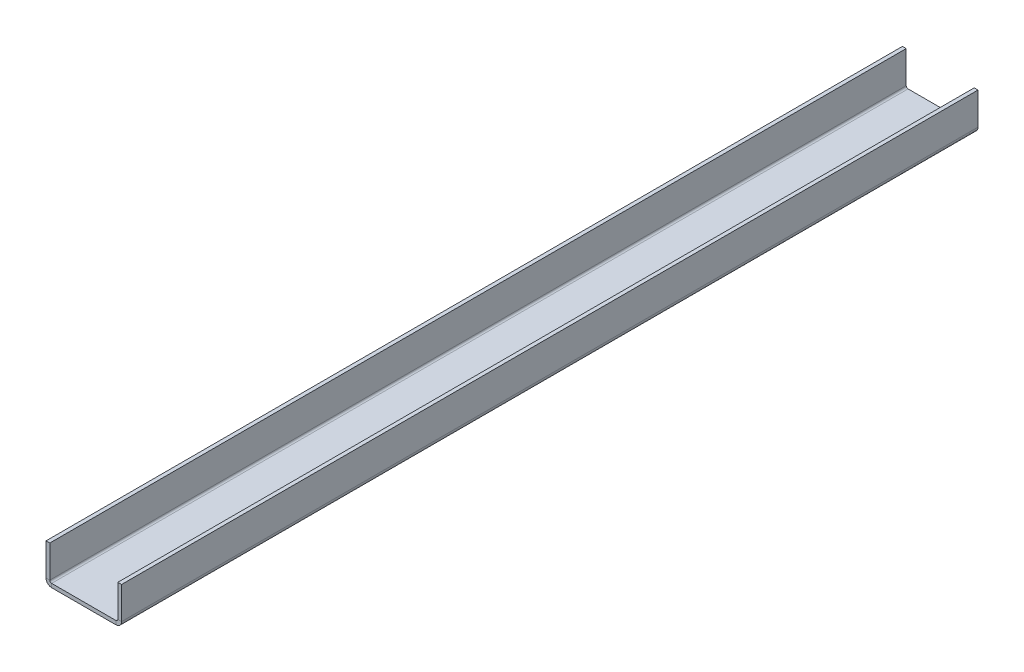
ISO-10303-21;
HEADER;
FILE_DESCRIPTION(('STEP AP214'),'2;1');
FILE_NAME('part.step','',(''),(''),'','','');
FILE_SCHEMA(('AUTOMOTIVE_DESIGN { 1 0 10303 214 1 1 1 1 }'));
ENDSEC;
DATA;
#1=APPLICATION_CONTEXT('core data for automotive mechanical design processes');
#2=APPLICATION_PROTOCOL_DEFINITION('international standard','automotive_design',2000,#1);
#3=PRODUCT_CONTEXT('',#1,'mechanical');
#4=PRODUCT('Part','Part','',(#3));
#5=PRODUCT_RELATED_PRODUCT_CATEGORY('part','',(#4));
#6=PRODUCT_DEFINITION_FORMATION('','',#4);
#7=PRODUCT_DEFINITION_CONTEXT('part definition',#1,'design');
#8=PRODUCT_DEFINITION('design','',#6,#7);
#9=PRODUCT_DEFINITION_SHAPE('','',#8);
#10=(LENGTH_UNIT() NAMED_UNIT(*) SI_UNIT(.MILLI.,.METRE.));
#11=(NAMED_UNIT(*) PLANE_ANGLE_UNIT() SI_UNIT($,.RADIAN.));
#12=(NAMED_UNIT(*) SI_UNIT($,.STERADIAN.) SOLID_ANGLE_UNIT());
#13=UNCERTAINTY_MEASURE_WITH_UNIT(LENGTH_MEASURE(1.E-05),#10,'distance_accuracy_value','');
#14=(GEOMETRIC_REPRESENTATION_CONTEXT(3) GLOBAL_UNCERTAINTY_ASSIGNED_CONTEXT((#13)) GLOBAL_UNIT_ASSIGNED_CONTEXT((#10,
#11,#12)) REPRESENTATION_CONTEXT('',''));
#15=CARTESIAN_POINT('',(0.,0.,0.));
#16=DIRECTION('',(0.,0.,1.));
#17=DIRECTION('',(1.,0.,0.));
#18=AXIS2_PLACEMENT_3D('',#15,#16,#17);
#19=CARTESIAN_POINT('',(0.,-1.5,0.));
#20=DIRECTION('',(0.,-1.,0.));
#21=DIRECTION('',(0.,0.,-1.));
#22=AXIS2_PLACEMENT_3D('',#19,#20,#21);
#23=PLANE('',#22);
#24=DIRECTION('',(1.,0.,0.));
#25=VECTOR('',#24,1.);
#26=CARTESIAN_POINT('',(-15.,-1.5,170.));
#27=LINE('',#26,#25);
#28=CARTESIAN_POINT('',(-12.7634,-1.5,170.));
#29=VERTEX_POINT('',#28);
#30=CARTESIAN_POINT('',(12.7634,-1.5,170.));
#31=VERTEX_POINT('',#30);
#32=EDGE_CURVE('E11',#29,#31,#27,.T.);
#33=ORIENTED_EDGE('',*,*,#32,.F.);
#34=DIRECTION('',(0.,0.,1.));
#35=VECTOR('',#34,1.);
#36=CARTESIAN_POINT('',(-12.7634,-1.5,170.));
#37=LINE('',#36,#35);
#38=CARTESIAN_POINT('',(-12.7634,-1.5,-170.));
#39=VERTEX_POINT('',#38);
#40=EDGE_CURVE('E149',#29,#39,#37,.F.);
#41=ORIENTED_EDGE('',*,*,#40,.T.);
#42=DIRECTION('',(-1.,0.,0.));
#43=VECTOR('',#42,1.);
#44=CARTESIAN_POINT('',(-15.,-1.5,-170.));
#45=LINE('',#44,#43);
#46=CARTESIAN_POINT('',(12.7634,-1.5,-170.));
#47=VERTEX_POINT('',#46);
#48=EDGE_CURVE('E26',#47,#39,#45,.T.);
#49=ORIENTED_EDGE('',*,*,#48,.F.);
#50=DIRECTION('',(0.,0.,-1.));
#51=VECTOR('',#50,1.);
#52=CARTESIAN_POINT('',(12.7634,-1.5,-170.));
#53=LINE('',#52,#51);
#54=EDGE_CURVE('E200',#47,#31,#53,.F.);
#55=ORIENTED_EDGE('',*,*,#54,.T.);
#56=EDGE_LOOP('',(#33,#41,#49,#55));
#57=FACE_BOUND('',#56,.T.);
#58=ADVANCED_FACE('F17',(#57),#23,.T.);
#59=CARTESIAN_POINT('',(0.,0.,0.));
#60=DIRECTION('',(0.,-1.,0.));
#61=DIRECTION('',(0.,0.,-1.));
#62=AXIS2_PLACEMENT_3D('',#59,#60,#61);
#63=PLANE('',#62);
#64=DIRECTION('',(0.,0.,1.));
#65=VECTOR('',#64,1.);
#66=CARTESIAN_POINT('',(-12.7634,0.,170.));
#67=LINE('',#66,#65);
#68=CARTESIAN_POINT('',(-12.7634,0.,170.));
#69=VERTEX_POINT('',#68);
#70=CARTESIAN_POINT('',(-12.7634,0.,-170.));
#71=VERTEX_POINT('',#70);
#72=EDGE_CURVE('E160',#69,#71,#67,.F.);
#73=ORIENTED_EDGE('',*,*,#72,.F.);
#74=DIRECTION('',(1.,0.,0.));
#75=VECTOR('',#74,1.);
#76=CARTESIAN_POINT('',(-15.,0.,170.));
#77=LINE('',#76,#75);
#78=CARTESIAN_POINT('',(12.7634,0.,170.));
#79=VERTEX_POINT('',#78);
#80=EDGE_CURVE('E21',#69,#79,#77,.T.);
#81=ORIENTED_EDGE('',*,*,#80,.T.);
#82=DIRECTION('',(0.,0.,-1.));
#83=VECTOR('',#82,1.);
#84=CARTESIAN_POINT('',(12.7634,0.,-170.));
#85=LINE('',#84,#83);
#86=CARTESIAN_POINT('',(12.7634,0.,-170.));
#87=VERTEX_POINT('',#86);
#88=EDGE_CURVE('E211',#87,#79,#85,.F.);
#89=ORIENTED_EDGE('',*,*,#88,.F.);
#90=DIRECTION('',(-1.,0.,0.));
#91=VECTOR('',#90,1.);
#92=CARTESIAN_POINT('',(-15.,0.,-170.));
#93=LINE('',#92,#91);
#94=EDGE_CURVE('E217',#87,#71,#93,.T.);
#95=ORIENTED_EDGE('',*,*,#94,.T.);
#96=EDGE_LOOP('',(#73,#81,#89,#95));
#97=FACE_BOUND('',#96,.T.);
#98=ADVANCED_FACE('F229',(#97),#63,.F.);
#99=CARTESIAN_POINT('',(-15.,-1.5,170.));
#100=DIRECTION('',(0.,0.,1.));
#101=DIRECTION('',(1.,0.,0.));
#102=AXIS2_PLACEMENT_3D('',#99,#100,#101);
#103=PLANE('',#102);
#104=ORIENTED_EDGE('',*,*,#80,.F.);
#105=DIRECTION('',(0.,-1.,0.));
#106=VECTOR('',#105,1.);
#107=CARTESIAN_POINT('',(-12.7634,0.,170.));
#108=LINE('',#107,#106);
#109=EDGE_CURVE('E154',#69,#29,#108,.T.);
#110=ORIENTED_EDGE('',*,*,#109,.T.);
#111=ORIENTED_EDGE('',*,*,#32,.T.);
#112=DIRECTION('',(0.,-1.,0.));
#113=VECTOR('',#112,1.);
#114=CARTESIAN_POINT('',(12.7634,0.,170.));
#115=LINE('',#114,#113);
#116=EDGE_CURVE('E215',#79,#31,#115,.T.);
#117=ORIENTED_EDGE('',*,*,#116,.F.);
#118=EDGE_LOOP('',(#104,#110,#111,#117));
#119=FACE_BOUND('',#118,.T.);
#120=ADVANCED_FACE('F231',(#119),#103,.T.);
#121=CARTESIAN_POINT('',(-15.,-1.5,-170.));
#122=DIRECTION('',(0.,0.,-1.));
#123=DIRECTION('',(-1.,0.,0.));
#124=AXIS2_PLACEMENT_3D('',#121,#122,#123);
#125=PLANE('',#124);
#126=DIRECTION('',(0.,-1.,0.));
#127=VECTOR('',#126,1.);
#128=CARTESIAN_POINT('',(-12.7634,0.,-170.));
#129=LINE('',#128,#127);
#130=EDGE_CURVE('E165',#71,#39,#129,.T.);
#131=ORIENTED_EDGE('',*,*,#130,.F.);
#132=ORIENTED_EDGE('',*,*,#94,.F.);
#133=DIRECTION('',(0.,-1.,0.));
#134=VECTOR('',#133,1.);
#135=CARTESIAN_POINT('',(12.7634,0.,-170.));
#136=LINE('',#135,#134);
#137=EDGE_CURVE('E205',#87,#47,#136,.T.);
#138=ORIENTED_EDGE('',*,*,#137,.T.);
#139=ORIENTED_EDGE('',*,*,#48,.T.);
#140=EDGE_LOOP('',(#131,#132,#138,#139));
#141=FACE_BOUND('',#140,.T.);
#142=ADVANCED_FACE('F19',(#141),#125,.T.);
#143=CARTESIAN_POINT('',(12.7634,0.7366,170.));
#144=DIRECTION('',(0.,0.,1.));
#145=DIRECTION('',(1.,0.,0.));
#146=AXIS2_PLACEMENT_3D('',#143,#144,#145);
#147=PLANE('',#146);
#148=DIRECTION('',(-1.,0.,0.));
#149=VECTOR('',#148,1.);
#150=CARTESIAN_POINT('',(15.,0.736599999999992,170.));
#151=LINE('',#150,#149);
#152=CARTESIAN_POINT('',(13.5,0.7366,170.));
#153=VERTEX_POINT('',#152);
#154=CARTESIAN_POINT('',(15.,0.7366,170.));
#155=VERTEX_POINT('',#154);
#156=EDGE_CURVE('E167',#153,#155,#151,.F.);
#157=ORIENTED_EDGE('',*,*,#156,.F.);
#158=CARTESIAN_POINT('',(12.7634,0.7366,170.));
#159=DIRECTION('',(0.,0.,-1.));
#160=DIRECTION('',(-1.,0.,0.));
#161=AXIS2_PLACEMENT_3D('',#158,#159,#160);
#162=CIRCLE('',#161,0.7366);
#163=EDGE_CURVE('E208',#79,#153,#162,.F.);
#164=ORIENTED_EDGE('',*,*,#163,.F.);
#165=ORIENTED_EDGE('',*,*,#116,.T.);
#166=CARTESIAN_POINT('',(12.7634,0.7366,170.));
#167=DIRECTION('',(0.,0.,-1.));
#168=DIRECTION('',(-1.,0.,0.));
#169=AXIS2_PLACEMENT_3D('',#166,#167,#168);
#170=CIRCLE('',#169,2.2366);
#171=EDGE_CURVE('E34',#31,#155,#170,.F.);
#172=ORIENTED_EDGE('',*,*,#171,.T.);
#173=EDGE_LOOP('',(#157,#164,#165,#172));
#174=FACE_BOUND('',#173,.T.);
#175=ADVANCED_FACE('F235',(#174),#147,.T.);
#176=CARTESIAN_POINT('',(12.7634,0.7366,-170.));
#177=DIRECTION('',(0.,0.,1.));
#178=DIRECTION('',(1.,0.,0.));
#179=AXIS2_PLACEMENT_3D('',#176,#177,#178);
#180=PLANE('',#179);
#181=CARTESIAN_POINT('',(12.7634,0.7366,-170.));
#182=DIRECTION('',(0.,0.,-1.));
#183=DIRECTION('',(-1.,0.,0.));
#184=AXIS2_PLACEMENT_3D('',#181,#182,#183);
#185=CIRCLE('',#184,0.7366);
#186=CARTESIAN_POINT('',(13.5,0.7366,-170.));
#187=VERTEX_POINT('',#186);
#188=EDGE_CURVE('E173',#187,#87,#185,.T.);
#189=ORIENTED_EDGE('',*,*,#188,.F.);
#190=DIRECTION('',(-1.,0.,0.));
#191=VECTOR('',#190,1.);
#192=CARTESIAN_POINT('',(13.5,0.7366,-170.));
#193=LINE('',#192,#191);
#194=CARTESIAN_POINT('',(15.,0.7366,-170.));
#195=VERTEX_POINT('',#194);
#196=EDGE_CURVE('E193',#187,#195,#193,.F.);
#197=ORIENTED_EDGE('',*,*,#196,.T.);
#198=CARTESIAN_POINT('',(12.7634,0.7366,-170.));
#199=DIRECTION('',(0.,0.,-1.));
#200=DIRECTION('',(-1.,0.,0.));
#201=AXIS2_PLACEMENT_3D('',#198,#199,#200);
#202=CIRCLE('',#201,2.2366);
#203=EDGE_CURVE('E203',#195,#47,#202,.T.);
#204=ORIENTED_EDGE('',*,*,#203,.T.);
#205=ORIENTED_EDGE('',*,*,#137,.F.);
#206=EDGE_LOOP('',(#189,#197,#204,#205));
#207=FACE_BOUND('',#206,.T.);
#208=ADVANCED_FACE('F259',(#207),#180,.F.);
#209=CARTESIAN_POINT('',(12.7634,0.7366,-170.));
#210=DIRECTION('',(0.,0.,-1.));
#211=DIRECTION('',(1.,0.,0.));
#212=AXIS2_PLACEMENT_3D('',#209,#210,#211);
#213=CYLINDRICAL_SURFACE('',#212,2.2366);
#214=ORIENTED_EDGE('',*,*,#54,.F.);
#215=ORIENTED_EDGE('',*,*,#203,.F.);
#216=DIRECTION('',(0.,0.,-1.));
#217=VECTOR('',#216,1.);
#218=CARTESIAN_POINT('',(15.,0.736599999999992,170.));
#219=LINE('',#218,#217);
#220=EDGE_CURVE('E191',#195,#155,#219,.F.);
#221=ORIENTED_EDGE('',*,*,#220,.T.);
#222=ORIENTED_EDGE('',*,*,#171,.F.);
#223=EDGE_LOOP('',(#214,#215,#221,#222));
#224=FACE_BOUND('',#223,.T.);
#225=ADVANCED_FACE('F262',(#224),#213,.T.);
#226=CARTESIAN_POINT('',(12.7634,0.7366,-170.));
#227=DIRECTION('',(0.,0.,-1.));
#228=DIRECTION('',(1.,0.,0.));
#229=AXIS2_PLACEMENT_3D('',#226,#227,#228);
#230=CYLINDRICAL_SURFACE('',#229,0.7366);
#231=ORIENTED_EDGE('',*,*,#88,.T.);
#232=ORIENTED_EDGE('',*,*,#163,.T.);
#233=DIRECTION('',(0.,0.,-1.));
#234=VECTOR('',#233,1.);
#235=CARTESIAN_POINT('',(13.5,0.7366,170.));
#236=LINE('',#235,#234);
#237=EDGE_CURVE('E196',#153,#187,#236,.T.);
#238=ORIENTED_EDGE('',*,*,#237,.T.);
#239=ORIENTED_EDGE('',*,*,#188,.T.);
#240=EDGE_LOOP('',(#231,#232,#238,#239));
#241=FACE_BOUND('',#240,.T.);
#242=ADVANCED_FACE('F238',(#241),#230,.F.);
#243=CARTESIAN_POINT('',(15.,13.5,-170.));
#244=DIRECTION('',(0.,0.,1.));
#245=DIRECTION('',(1.,0.,0.));
#246=AXIS2_PLACEMENT_3D('',#243,#244,#245);
#247=PLANE('',#246);
#248=ORIENTED_EDGE('',*,*,#196,.F.);
#249=DIRECTION('',(0.,-1.,0.));
#250=VECTOR('',#249,1.);
#251=CARTESIAN_POINT('',(13.5,13.5,-170.));
#252=LINE('',#251,#250);
#253=CARTESIAN_POINT('',(13.5,13.5,-170.));
#254=VERTEX_POINT('',#253);
#255=EDGE_CURVE('E189',#187,#254,#252,.F.);
#256=ORIENTED_EDGE('',*,*,#255,.T.);
#257=DIRECTION('',(-1.,0.,0.));
#258=VECTOR('',#257,1.);
#259=CARTESIAN_POINT('',(15.,13.5,-170.));
#260=LINE('',#259,#258);
#261=CARTESIAN_POINT('',(15.,13.5,-170.));
#262=VERTEX_POINT('',#261);
#263=EDGE_CURVE('E170',#262,#254,#260,.T.);
#264=ORIENTED_EDGE('',*,*,#263,.F.);
#265=DIRECTION('',(0.,1.,0.));
#266=VECTOR('',#265,1.);
#267=CARTESIAN_POINT('',(15.,0.,-170.));
#268=LINE('',#267,#266);
#269=EDGE_CURVE('E182',#195,#262,#268,.T.);
#270=ORIENTED_EDGE('',*,*,#269,.F.);
#271=EDGE_LOOP('',(#248,#256,#264,#270));
#272=FACE_BOUND('',#271,.T.);
#273=ADVANCED_FACE('F256',(#272),#247,.F.);
#274=CARTESIAN_POINT('',(15.,0.,170.));
#275=DIRECTION('',(0.,0.,-1.));
#276=DIRECTION('',(-1.,0.,0.));
#277=AXIS2_PLACEMENT_3D('',#274,#275,#276);
#278=PLANE('',#277);
#279=ORIENTED_EDGE('',*,*,#156,.T.);
#280=DIRECTION('',(0.,-1.,0.));
#281=VECTOR('',#280,1.);
#282=CARTESIAN_POINT('',(15.,0.,170.));
#283=LINE('',#282,#281);
#284=CARTESIAN_POINT('',(15.,13.5,170.));
#285=VERTEX_POINT('',#284);
#286=EDGE_CURVE('E177',#285,#155,#283,.T.);
#287=ORIENTED_EDGE('',*,*,#286,.F.);
#288=DIRECTION('',(-1.,0.,0.));
#289=VECTOR('',#288,1.);
#290=CARTESIAN_POINT('',(15.,13.5,170.));
#291=LINE('',#290,#289);
#292=CARTESIAN_POINT('',(13.5,13.5,170.));
#293=VERTEX_POINT('',#292);
#294=EDGE_CURVE('E174',#285,#293,#291,.T.);
#295=ORIENTED_EDGE('',*,*,#294,.T.);
#296=DIRECTION('',(0.,1.,0.));
#297=VECTOR('',#296,1.);
#298=CARTESIAN_POINT('',(13.5,0.,170.));
#299=LINE('',#298,#297);
#300=EDGE_CURVE('E184',#293,#153,#299,.F.);
#301=ORIENTED_EDGE('',*,*,#300,.T.);
#302=EDGE_LOOP('',(#279,#287,#295,#301));
#303=FACE_BOUND('',#302,.T.);
#304=ADVANCED_FACE('F246',(#303),#278,.F.);
#305=CARTESIAN_POINT('',(15.,0.,0.));
#306=DIRECTION('',(-1.,0.,0.));
#307=DIRECTION('',(0.,-1.,0.));
#308=AXIS2_PLACEMENT_3D('',#305,#306,#307);
#309=PLANE('',#308);
#310=ORIENTED_EDGE('',*,*,#220,.F.);
#311=ORIENTED_EDGE('',*,*,#269,.T.);
#312=DIRECTION('',(0.,0.,1.));
#313=VECTOR('',#312,1.);
#314=CARTESIAN_POINT('',(15.,13.5,0.));
#315=LINE('',#314,#313);
#316=EDGE_CURVE('E180',#262,#285,#315,.T.);
#317=ORIENTED_EDGE('',*,*,#316,.T.);
#318=ORIENTED_EDGE('',*,*,#286,.T.);
#319=EDGE_LOOP('',(#310,#311,#317,#318));
#320=FACE_BOUND('',#319,.T.);
#321=ADVANCED_FACE('F261',(#320),#309,.F.);
#322=CARTESIAN_POINT('',(13.5,0.,0.));
#323=DIRECTION('',(-1.,0.,0.));
#324=DIRECTION('',(0.,-1.,0.));
#325=AXIS2_PLACEMENT_3D('',#322,#323,#324);
#326=PLANE('',#325);
#327=ORIENTED_EDGE('',*,*,#255,.F.);
#328=ORIENTED_EDGE('',*,*,#237,.F.);
#329=ORIENTED_EDGE('',*,*,#300,.F.);
#330=DIRECTION('',(0.,0.,-1.));
#331=VECTOR('',#330,1.);
#332=CARTESIAN_POINT('',(13.5,13.5,170.));
#333=LINE('',#332,#331);
#334=EDGE_CURVE('E187',#254,#293,#333,.F.);
#335=ORIENTED_EDGE('',*,*,#334,.F.);
#336=EDGE_LOOP('',(#327,#328,#329,#335));
#337=FACE_BOUND('',#336,.T.);
#338=ADVANCED_FACE('F243',(#337),#326,.T.);
#339=CARTESIAN_POINT('',(15.,13.5,170.));
#340=DIRECTION('',(0.,-1.,0.));
#341=DIRECTION('',(1.,0.,0.));
#342=AXIS2_PLACEMENT_3D('',#339,#340,#341);
#343=PLANE('',#342);
#344=ORIENTED_EDGE('',*,*,#334,.T.);
#345=ORIENTED_EDGE('',*,*,#294,.F.);
#346=ORIENTED_EDGE('',*,*,#316,.F.);
#347=ORIENTED_EDGE('',*,*,#263,.T.);
#348=EDGE_LOOP('',(#344,#345,#346,#347));
#349=FACE_BOUND('',#348,.T.);
#350=ADVANCED_FACE('F251',(#349),#343,.F.);
#351=CARTESIAN_POINT('',(-12.7634,0.7366,-170.));
#352=DIRECTION('',(0.,0.,-1.));
#353=DIRECTION('',(-1.,0.,0.));
#354=AXIS2_PLACEMENT_3D('',#351,#352,#353);
#355=PLANE('',#354);
#356=DIRECTION('',(1.,0.,0.));
#357=VECTOR('',#356,1.);
#358=CARTESIAN_POINT('',(-15.,0.736599999999992,-170.));
#359=LINE('',#358,#357);
#360=CARTESIAN_POINT('',(-13.5,0.7366,-170.));
#361=VERTEX_POINT('',#360);
#362=CARTESIAN_POINT('',(-15.,0.73659999999999,-170.));
#363=VERTEX_POINT('',#362);
#364=EDGE_CURVE('E132',#361,#363,#359,.F.);
#365=ORIENTED_EDGE('',*,*,#364,.F.);
#366=CARTESIAN_POINT('',(-12.7634,0.7366,-170.));
#367=DIRECTION('',(0.,0.,1.));
#368=DIRECTION('',(1.,0.,0.));
#369=AXIS2_PLACEMENT_3D('',#366,#367,#368);
#370=CIRCLE('',#369,0.7366);
#371=EDGE_CURVE('E157',#71,#361,#370,.F.);
#372=ORIENTED_EDGE('',*,*,#371,.F.);
#373=ORIENTED_EDGE('',*,*,#130,.T.);
#374=CARTESIAN_POINT('',(-12.7634,0.7366,-170.));
#375=DIRECTION('',(0.,0.,1.));
#376=DIRECTION('',(1.,0.,0.));
#377=AXIS2_PLACEMENT_3D('',#374,#375,#376);
#378=CIRCLE('',#377,2.2366);
#379=EDGE_CURVE('E42',#39,#363,#378,.F.);
#380=ORIENTED_EDGE('',*,*,#379,.T.);
#381=EDGE_LOOP('',(#365,#372,#373,#380));
#382=FACE_BOUND('',#381,.T.);
#383=ADVANCED_FACE('F269',(#382),#355,.T.);
#384=CARTESIAN_POINT('',(-12.7634,0.7366,170.));
#385=DIRECTION('',(0.,0.,-1.));
#386=DIRECTION('',(-1.,0.,0.));
#387=AXIS2_PLACEMENT_3D('',#384,#385,#386);
#388=PLANE('',#387);
#389=CARTESIAN_POINT('',(-12.7634,0.7366,170.));
#390=DIRECTION('',(0.,0.,1.));
#391=DIRECTION('',(1.,0.,0.));
#392=AXIS2_PLACEMENT_3D('',#389,#390,#391);
#393=CIRCLE('',#392,0.7366);
#394=CARTESIAN_POINT('',(-13.5,0.7366,170.));
#395=VERTEX_POINT('',#394);
#396=EDGE_CURVE('E162',#395,#69,#393,.T.);
#397=ORIENTED_EDGE('',*,*,#396,.F.);
#398=DIRECTION('',(1.,0.,0.));
#399=VECTOR('',#398,1.);
#400=CARTESIAN_POINT('',(-13.5,0.7366,170.));
#401=LINE('',#400,#399);
#402=CARTESIAN_POINT('',(-15.,0.736599999999988,170.));
#403=VERTEX_POINT('',#402);
#404=EDGE_CURVE('E143',#395,#403,#401,.F.);
#405=ORIENTED_EDGE('',*,*,#404,.T.);
#406=CARTESIAN_POINT('',(-12.7634,0.7366,170.));
#407=DIRECTION('',(0.,0.,1.));
#408=DIRECTION('',(1.,0.,0.));
#409=AXIS2_PLACEMENT_3D('',#406,#407,#408);
#410=CIRCLE('',#409,2.2366);
#411=EDGE_CURVE('E152',#403,#29,#410,.T.);
#412=ORIENTED_EDGE('',*,*,#411,.T.);
#413=ORIENTED_EDGE('',*,*,#109,.F.);
#414=EDGE_LOOP('',(#397,#405,#412,#413));
#415=FACE_BOUND('',#414,.T.);
#416=ADVANCED_FACE('F282',(#415),#388,.F.);
#417=CARTESIAN_POINT('',(-12.7634,0.7366,170.));
#418=DIRECTION('',(0.,0.,1.));
#419=DIRECTION('',(-1.,0.,0.));
#420=AXIS2_PLACEMENT_3D('',#417,#418,#419);
#421=CYLINDRICAL_SURFACE('',#420,2.2366);
#422=ORIENTED_EDGE('',*,*,#40,.F.);
#423=ORIENTED_EDGE('',*,*,#411,.F.);
#424=DIRECTION('',(0.,0.,1.));
#425=VECTOR('',#424,1.);
#426=CARTESIAN_POINT('',(-15.,0.736599999999992,-170.));
#427=LINE('',#426,#425);
#428=EDGE_CURVE('E141',#403,#363,#427,.F.);
#429=ORIENTED_EDGE('',*,*,#428,.T.);
#430=ORIENTED_EDGE('',*,*,#379,.F.);
#431=EDGE_LOOP('',(#422,#423,#429,#430));
#432=FACE_BOUND('',#431,.T.);
#433=ADVANCED_FACE('F283',(#432),#421,.T.);
#434=CARTESIAN_POINT('',(-12.7634,0.7366,170.));
#435=DIRECTION('',(0.,0.,1.));
#436=DIRECTION('',(-1.,0.,0.));
#437=AXIS2_PLACEMENT_3D('',#434,#435,#436);
#438=CYLINDRICAL_SURFACE('',#437,0.7366);
#439=ORIENTED_EDGE('',*,*,#72,.T.);
#440=ORIENTED_EDGE('',*,*,#371,.T.);
#441=DIRECTION('',(0.,0.,1.));
#442=VECTOR('',#441,1.);
#443=CARTESIAN_POINT('',(-13.5,0.7366,-170.));
#444=LINE('',#443,#442);
#445=EDGE_CURVE('E146',#361,#395,#444,.T.);
#446=ORIENTED_EDGE('',*,*,#445,.T.);
#447=ORIENTED_EDGE('',*,*,#396,.T.);
#448=EDGE_LOOP('',(#439,#440,#446,#447));
#449=FACE_BOUND('',#448,.T.);
#450=ADVANCED_FACE('F272',(#449),#438,.F.);
#451=CARTESIAN_POINT('',(-15.,0.,-170.));
#452=DIRECTION('',(0.,0.,1.));
#453=DIRECTION('',(1.,0.,0.));
#454=AXIS2_PLACEMENT_3D('',#451,#452,#453);
#455=PLANE('',#454);
#456=ORIENTED_EDGE('',*,*,#364,.T.);
#457=DIRECTION('',(0.,-1.,0.));
#458=VECTOR('',#457,1.);
#459=CARTESIAN_POINT('',(-15.,0.,-170.));
#460=LINE('',#459,#458);
#461=CARTESIAN_POINT('',(-15.,13.5,-170.));
#462=VERTEX_POINT('',#461);
#463=EDGE_CURVE('E113',#462,#363,#460,.T.);
#464=ORIENTED_EDGE('',*,*,#463,.F.);
#465=DIRECTION('',(1.,0.,0.));
#466=VECTOR('',#465,1.);
#467=CARTESIAN_POINT('',(-15.,13.5,-170.));
#468=LINE('',#467,#466);
#469=CARTESIAN_POINT('',(-13.5,13.5,-170.));
#470=VERTEX_POINT('',#469);
#471=EDGE_CURVE('E119',#462,#470,#468,.T.);
#472=ORIENTED_EDGE('',*,*,#471,.T.);
#473=DIRECTION('',(0.,1.,0.));
#474=VECTOR('',#473,1.);
#475=CARTESIAN_POINT('',(-13.5,0.,-170.));
#476=LINE('',#475,#474);
#477=EDGE_CURVE('E139',#470,#361,#476,.F.);
#478=ORIENTED_EDGE('',*,*,#477,.T.);
#479=EDGE_LOOP('',(#456,#464,#472,#478));
#480=FACE_BOUND('',#479,.T.);
#481=ADVANCED_FACE('F131',(#480),#455,.F.);
#482=CARTESIAN_POINT('',(-15.,13.5,170.));
#483=DIRECTION('',(0.,0.,-1.));
#484=DIRECTION('',(-1.,0.,0.));
#485=AXIS2_PLACEMENT_3D('',#482,#483,#484);
#486=PLANE('',#485);
#487=ORIENTED_EDGE('',*,*,#404,.F.);
#488=DIRECTION('',(0.,-1.,0.));
#489=VECTOR('',#488,1.);
#490=CARTESIAN_POINT('',(-13.5,13.5,170.));
#491=LINE('',#490,#489);
#492=CARTESIAN_POINT('',(-13.5,13.5,170.));
#493=VERTEX_POINT('',#492);
#494=EDGE_CURVE('E135',#395,#493,#491,.F.);
#495=ORIENTED_EDGE('',*,*,#494,.T.);
#496=DIRECTION('',(1.,0.,0.));
#497=VECTOR('',#496,1.);
#498=CARTESIAN_POINT('',(-15.,13.5,170.));
#499=LINE('',#498,#497);
#500=CARTESIAN_POINT('',(-15.,13.5,170.));
#501=VERTEX_POINT('',#500);
#502=EDGE_CURVE('E128',#501,#493,#499,.T.);
#503=ORIENTED_EDGE('',*,*,#502,.F.);
#504=DIRECTION('',(0.,1.,0.));
#505=VECTOR('',#504,1.);
#506=CARTESIAN_POINT('',(-15.,0.,170.));
#507=LINE('',#506,#505);
#508=EDGE_CURVE('E115',#403,#501,#507,.T.);
#509=ORIENTED_EDGE('',*,*,#508,.F.);
#510=EDGE_LOOP('',(#487,#495,#503,#509));
#511=FACE_BOUND('',#510,.T.);
#512=ADVANCED_FACE('F279',(#511),#486,.F.);
#513=CARTESIAN_POINT('',(-15.,0.,0.));
#514=DIRECTION('',(1.,0.,0.));
#515=DIRECTION('',(0.,1.,0.));
#516=AXIS2_PLACEMENT_3D('',#513,#514,#515);
#517=PLANE('',#516);
#518=ORIENTED_EDGE('',*,*,#428,.F.);
#519=ORIENTED_EDGE('',*,*,#508,.T.);
#520=DIRECTION('',(0.,0.,-1.));
#521=VECTOR('',#520,1.);
#522=CARTESIAN_POINT('',(-15.,13.5,0.));
#523=LINE('',#522,#521);
#524=EDGE_CURVE('E108',#501,#462,#523,.T.);
#525=ORIENTED_EDGE('',*,*,#524,.T.);
#526=ORIENTED_EDGE('',*,*,#463,.T.);
#527=EDGE_LOOP('',(#518,#519,#525,#526));
#528=FACE_BOUND('',#527,.T.);
#529=ADVANCED_FACE('F111',(#528),#517,.F.);
#530=CARTESIAN_POINT('',(-13.5,0.,0.));
#531=DIRECTION('',(1.,0.,0.));
#532=DIRECTION('',(0.,1.,0.));
#533=AXIS2_PLACEMENT_3D('',#530,#531,#532);
#534=PLANE('',#533);
#535=ORIENTED_EDGE('',*,*,#494,.F.);
#536=ORIENTED_EDGE('',*,*,#445,.F.);
#537=ORIENTED_EDGE('',*,*,#477,.F.);
#538=DIRECTION('',(0.,0.,1.));
#539=VECTOR('',#538,1.);
#540=CARTESIAN_POINT('',(-13.5,13.5,-170.));
#541=LINE('',#540,#539);
#542=EDGE_CURVE('E124',#493,#470,#541,.F.);
#543=ORIENTED_EDGE('',*,*,#542,.F.);
#544=EDGE_LOOP('',(#535,#536,#537,#543));
#545=FACE_BOUND('',#544,.T.);
#546=ADVANCED_FACE('F276',(#545),#534,.T.);
#547=CARTESIAN_POINT('',(-15.,13.5,-170.));
#548=DIRECTION('',(0.,-1.,0.));
#549=DIRECTION('',(1.,0.,0.));
#550=AXIS2_PLACEMENT_3D('',#547,#548,#549);
#551=PLANE('',#550);
#552=ORIENTED_EDGE('',*,*,#542,.T.);
#553=ORIENTED_EDGE('',*,*,#471,.F.);
#554=ORIENTED_EDGE('',*,*,#524,.F.);
#555=ORIENTED_EDGE('',*,*,#502,.T.);
#556=EDGE_LOOP('',(#552,#553,#554,#555));
#557=FACE_BOUND('',#556,.T.);
#558=ADVANCED_FACE('F122',(#557),#551,.F.);
#559=CLOSED_SHELL('',(#58,#98,#120,#142,#175,#208,#225,#242,#273,#304,#321,#338,#350,#383,#416,
#433,#450,#481,#512,#529,#546,#558));
#560=MANIFOLD_SOLID_BREP('B1',#559);
#561=ADVANCED_BREP_SHAPE_REPRESENTATION('',(#18,#560),#14);
#562=SHAPE_DEFINITION_REPRESENTATION(#9,#561);
ENDSEC;
END-ISO-10303-21;
